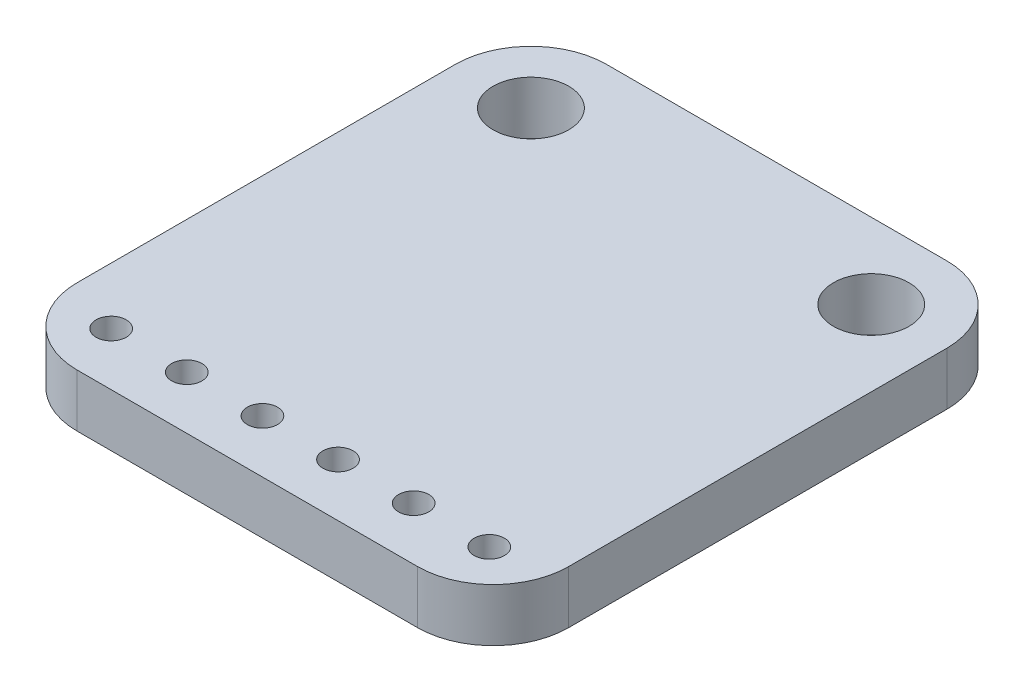
ISO-10303-21;
HEADER;
FILE_DESCRIPTION(('STEP AP214'),'2;1');
FILE_NAME('part.step','',(''),(''),'','','');
FILE_SCHEMA(('AUTOMOTIVE_DESIGN { 1 0 10303 214 1 1 1 1 }'));
ENDSEC;
DATA;
#1=APPLICATION_CONTEXT('core data for automotive mechanical design processes');
#2=APPLICATION_PROTOCOL_DEFINITION('international standard','automotive_design',2000,#1);
#3=PRODUCT_CONTEXT('',#1,'mechanical');
#4=PRODUCT('Part','Part','',(#3));
#5=PRODUCT_RELATED_PRODUCT_CATEGORY('part','',(#4));
#6=PRODUCT_DEFINITION_FORMATION('','',#4);
#7=PRODUCT_DEFINITION_CONTEXT('part definition',#1,'design');
#8=PRODUCT_DEFINITION('design','',#6,#7);
#9=PRODUCT_DEFINITION_SHAPE('','',#8);
#10=(LENGTH_UNIT() NAMED_UNIT(*) SI_UNIT(.MILLI.,.METRE.));
#11=(NAMED_UNIT(*) PLANE_ANGLE_UNIT() SI_UNIT($,.RADIAN.));
#12=(NAMED_UNIT(*) SI_UNIT($,.STERADIAN.) SOLID_ANGLE_UNIT());
#13=UNCERTAINTY_MEASURE_WITH_UNIT(LENGTH_MEASURE(1.E-05),#10,'distance_accuracy_value','');
#14=(GEOMETRIC_REPRESENTATION_CONTEXT(3) GLOBAL_UNCERTAINTY_ASSIGNED_CONTEXT((#13)) GLOBAL_UNIT_ASSIGNED_CONTEXT((#10,
#11,#12)) REPRESENTATION_CONTEXT('',''));
#15=CARTESIAN_POINT('',(0.,0.,0.));
#16=DIRECTION('',(0.,0.,1.));
#17=DIRECTION('',(1.,0.,0.));
#18=AXIS2_PLACEMENT_3D('',#15,#16,#17);
#19=CARTESIAN_POINT('',(0.,0.,0.));
#20=DIRECTION('',(0.,1.,0.));
#21=DIRECTION('',(0.,0.,1.));
#22=AXIS2_PLACEMENT_3D('',#19,#20,#21);
#23=PLANE('',#22);
#24=CARTESIAN_POINT('',(-5.715,0.,-6.34999999999999));
#25=DIRECTION('',(0.,-1.,0.));
#26=DIRECTION('',(0.,0.,-1.));
#27=AXIS2_PLACEMENT_3D('',#24,#25,#26);
#28=CIRCLE('',#27,1.27);
#29=CARTESIAN_POINT('',(-5.715,0.,-7.61999999999999));
#30=VERTEX_POINT('',#29);
#31=EDGE_CURVE('E462',#30,#30,#28,.T.);
#32=ORIENTED_EDGE('',*,*,#31,.F.);
#33=EDGE_LOOP('',(#32));
#34=FACE_BOUND('',#33,.T.);
#35=CARTESIAN_POINT('',(5.715,0.,-6.34999999999999));
#36=DIRECTION('',(0.,-1.,0.));
#37=DIRECTION('',(0.,0.,-1.));
#38=AXIS2_PLACEMENT_3D('',#35,#36,#37);
#39=CIRCLE('',#38,1.27);
#40=CARTESIAN_POINT('',(5.715,0.,-7.61999999999999));
#41=VERTEX_POINT('',#40);
#42=EDGE_CURVE('E466',#41,#41,#39,.T.);
#43=ORIENTED_EDGE('',*,*,#42,.F.);
#44=EDGE_LOOP('',(#43));
#45=FACE_BOUND('',#44,.T.);
#46=DIRECTION('',(0.,0.,1.));
#47=VECTOR('',#46,1.);
#48=CARTESIAN_POINT('',(-8.255,0.,-8.89));
#49=LINE('',#48,#47);
#50=CARTESIAN_POINT('',(-8.255,0.,-6.34999999999999));
#51=VERTEX_POINT('',#50);
#52=CARTESIAN_POINT('',(-8.255,0.,6.35));
#53=VERTEX_POINT('',#52);
#54=EDGE_CURVE('E205',#51,#53,#49,.T.);
#55=ORIENTED_EDGE('',*,*,#54,.F.);
#56=CARTESIAN_POINT('',(-5.715,0.,-6.34999999999999));
#57=DIRECTION('',(0.,1.,0.));
#58=DIRECTION('',(0.,0.,1.));
#59=AXIS2_PLACEMENT_3D('',#56,#57,#58);
#60=CIRCLE('',#59,2.54);
#61=CARTESIAN_POINT('',(-5.715,0.,-8.89));
#62=VERTEX_POINT('',#61);
#63=EDGE_CURVE('E220',#51,#62,#60,.F.);
#64=ORIENTED_EDGE('',*,*,#63,.T.);
#65=DIRECTION('',(-1.,0.,0.));
#66=VECTOR('',#65,1.);
#67=CARTESIAN_POINT('',(-8.255,0.,-8.89));
#68=LINE('',#67,#66);
#69=CARTESIAN_POINT('',(5.715,0.,-8.89));
#70=VERTEX_POINT('',#69);
#71=EDGE_CURVE('E202',#70,#62,#68,.T.);
#72=ORIENTED_EDGE('',*,*,#71,.F.);
#73=CARTESIAN_POINT('',(5.715,0.,-6.34999999999999));
#74=DIRECTION('',(0.,1.,0.));
#75=DIRECTION('',(0.,0.,1.));
#76=AXIS2_PLACEMENT_3D('',#73,#74,#75);
#77=CIRCLE('',#76,2.54);
#78=CARTESIAN_POINT('',(8.255,0.,-6.34999999999999));
#79=VERTEX_POINT('',#78);
#80=EDGE_CURVE('E218',#70,#79,#77,.F.);
#81=ORIENTED_EDGE('',*,*,#80,.T.);
#82=DIRECTION('',(0.,0.,-1.));
#83=VECTOR('',#82,1.);
#84=CARTESIAN_POINT('',(8.255,0.,-8.89));
#85=LINE('',#84,#83);
#86=CARTESIAN_POINT('',(8.255,0.,6.35));
#87=VERTEX_POINT('',#86);
#88=EDGE_CURVE('E185',#87,#79,#85,.T.);
#89=ORIENTED_EDGE('',*,*,#88,.F.);
#90=CARTESIAN_POINT('',(5.715,0.,6.35));
#91=DIRECTION('',(0.,1.,0.));
#92=DIRECTION('',(0.,0.,1.));
#93=AXIS2_PLACEMENT_3D('',#90,#91,#92);
#94=CIRCLE('',#93,2.54);
#95=CARTESIAN_POINT('',(5.715,0.,8.89));
#96=VERTEX_POINT('',#95);
#97=EDGE_CURVE('E216',#87,#96,#94,.F.);
#98=ORIENTED_EDGE('',*,*,#97,.T.);
#99=DIRECTION('',(1.,0.,0.));
#100=VECTOR('',#99,1.);
#101=CARTESIAN_POINT('',(-8.255,0.,8.89));
#102=LINE('',#101,#100);
#103=CARTESIAN_POINT('',(-5.715,0.,8.89));
#104=VERTEX_POINT('',#103);
#105=EDGE_CURVE('E190',#104,#96,#102,.T.);
#106=ORIENTED_EDGE('',*,*,#105,.F.);
#107=CARTESIAN_POINT('',(-5.715,0.,6.35));
#108=DIRECTION('',(0.,1.,0.));
#109=DIRECTION('',(0.,0.,1.));
#110=AXIS2_PLACEMENT_3D('',#107,#108,#109);
#111=CIRCLE('',#110,2.54);
#112=EDGE_CURVE('E214',#104,#53,#111,.F.);
#113=ORIENTED_EDGE('',*,*,#112,.T.);
#114=EDGE_LOOP('',(#55,#64,#72,#81,#89,#98,#106,#113));
#115=FACE_BOUND('',#114,.T.);
#116=CARTESIAN_POINT('',(-6.35,0.,7.112));
#117=DIRECTION('',(0.,1.,0.));
#118=DIRECTION('',(0.,0.,1.));
#119=AXIS2_PLACEMENT_3D('',#116,#117,#118);
#120=CIRCLE('',#119,0.508);
#121=CARTESIAN_POINT('',(-6.35,0.,7.62));
#122=VERTEX_POINT('',#121);
#123=EDGE_CURVE('E182',#122,#122,#120,.F.);
#124=ORIENTED_EDGE('',*,*,#123,.F.);
#125=EDGE_LOOP('',(#124));
#126=FACE_BOUND('',#125,.T.);
#127=CARTESIAN_POINT('',(-3.81,0.,7.112));
#128=DIRECTION('',(0.,1.,0.));
#129=DIRECTION('',(0.,0.,1.));
#130=AXIS2_PLACEMENT_3D('',#127,#128,#129);
#131=CIRCLE('',#130,0.508);
#132=CARTESIAN_POINT('',(-3.81,0.,7.62));
#133=VERTEX_POINT('',#132);
#134=EDGE_CURVE('E176',#133,#133,#131,.F.);
#135=ORIENTED_EDGE('',*,*,#134,.F.);
#136=EDGE_LOOP('',(#135));
#137=FACE_BOUND('',#136,.T.);
#138=CARTESIAN_POINT('',(-1.27,0.,7.112));
#139=DIRECTION('',(0.,1.,0.));
#140=DIRECTION('',(0.,0.,1.));
#141=AXIS2_PLACEMENT_3D('',#138,#139,#140);
#142=CIRCLE('',#141,0.508);
#143=CARTESIAN_POINT('',(-1.27,0.,7.62));
#144=VERTEX_POINT('',#143);
#145=EDGE_CURVE('E170',#144,#144,#142,.F.);
#146=ORIENTED_EDGE('',*,*,#145,.F.);
#147=EDGE_LOOP('',(#146));
#148=FACE_BOUND('',#147,.T.);
#149=CARTESIAN_POINT('',(1.27,0.,7.112));
#150=DIRECTION('',(0.,1.,0.));
#151=DIRECTION('',(0.,0.,1.));
#152=AXIS2_PLACEMENT_3D('',#149,#150,#151);
#153=CIRCLE('',#152,0.508);
#154=CARTESIAN_POINT('',(1.27,0.,7.62));
#155=VERTEX_POINT('',#154);
#156=EDGE_CURVE('E164',#155,#155,#153,.F.);
#157=ORIENTED_EDGE('',*,*,#156,.F.);
#158=EDGE_LOOP('',(#157));
#159=FACE_BOUND('',#158,.T.);
#160=CARTESIAN_POINT('',(3.81,0.,7.112));
#161=DIRECTION('',(0.,1.,0.));
#162=DIRECTION('',(0.,0.,1.));
#163=AXIS2_PLACEMENT_3D('',#160,#161,#162);
#164=CIRCLE('',#163,0.508000000000001);
#165=CARTESIAN_POINT('',(3.81,0.,7.62));
#166=VERTEX_POINT('',#165);
#167=EDGE_CURVE('E158',#166,#166,#164,.F.);
#168=ORIENTED_EDGE('',*,*,#167,.F.);
#169=EDGE_LOOP('',(#168));
#170=FACE_BOUND('',#169,.T.);
#171=CARTESIAN_POINT('',(6.35,0.,7.112));
#172=DIRECTION('',(0.,1.,0.));
#173=DIRECTION('',(0.,0.,1.));
#174=AXIS2_PLACEMENT_3D('',#171,#172,#173);
#175=CIRCLE('',#174,0.508000000000001);
#176=CARTESIAN_POINT('',(6.35,0.,7.62));
#177=VERTEX_POINT('',#176);
#178=EDGE_CURVE('E147',#177,#177,#175,.F.);
#179=ORIENTED_EDGE('',*,*,#178,.F.);
#180=EDGE_LOOP('',(#179));
#181=FACE_BOUND('',#180,.T.);
#182=DIRECTION('',(0.,0.,1.));
#183=VECTOR('',#182,1.);
#184=CARTESIAN_POINT('',(1.975,0.,-3.24499999999999));
#185=LINE('',#184,#183);
#186=CARTESIAN_POINT('',(1.975,0.,-3.24499999999999));
#187=VERTEX_POINT('',#186);
#188=CARTESIAN_POINT('',(1.975,0.,0.705000000000006));
#189=VERTEX_POINT('',#188);
#190=EDGE_CURVE('E143',#187,#189,#185,.T.);
#191=ORIENTED_EDGE('',*,*,#190,.F.);
#192=DIRECTION('',(1.,0.,0.));
#193=VECTOR('',#192,1.);
#194=CARTESIAN_POINT('',(1.975,0.,-3.24499999999999));
#195=LINE('',#194,#193);
#196=CARTESIAN_POINT('',(-1.975,0.,-3.24499999999999));
#197=VERTEX_POINT('',#196);
#198=EDGE_CURVE('E140',#197,#187,#195,.T.);
#199=ORIENTED_EDGE('',*,*,#198,.F.);
#200=DIRECTION('',(0.,0.,-1.));
#201=VECTOR('',#200,1.);
#202=CARTESIAN_POINT('',(-1.975,0.,-3.24499999999999));
#203=LINE('',#202,#201);
#204=CARTESIAN_POINT('',(-1.975,0.,0.705000000000005));
#205=VERTEX_POINT('',#204);
#206=EDGE_CURVE('E55',#205,#197,#203,.T.);
#207=ORIENTED_EDGE('',*,*,#206,.F.);
#208=DIRECTION('',(-1.,0.,0.));
#209=VECTOR('',#208,1.);
#210=CARTESIAN_POINT('',(1.975,0.,0.705000000000006));
#211=LINE('',#210,#209);
#212=EDGE_CURVE('E50',#189,#205,#211,.T.);
#213=ORIENTED_EDGE('',*,*,#212,.F.);
#214=EDGE_LOOP('',(#191,#199,#207,#213));
#215=FACE_BOUND('',#214,.T.);
#216=ADVANCED_FACE('F35',(#34,#45,#115,#126,#137,#148,#159,#170,#181,#215),#23,.F.);
#217=CARTESIAN_POINT('',(8.255,1.778,-8.89));
#218=DIRECTION('',(-1.,0.,0.));
#219=DIRECTION('',(0.,0.,1.));
#220=AXIS2_PLACEMENT_3D('',#217,#218,#219);
#221=PLANE('',#220);
#222=ORIENTED_EDGE('',*,*,#88,.T.);
#223=DIRECTION('',(0.,-1.,0.));
#224=VECTOR('',#223,1.);
#225=CARTESIAN_POINT('',(8.255,1.778,-6.34999999999999));
#226=LINE('',#225,#224);
#227=CARTESIAN_POINT('',(8.255,1.778,-6.34999999999999));
#228=VERTEX_POINT('',#227);
#229=EDGE_CURVE('E238',#79,#228,#226,.F.);
#230=ORIENTED_EDGE('',*,*,#229,.T.);
#231=DIRECTION('',(0.,0.,-1.));
#232=VECTOR('',#231,1.);
#233=CARTESIAN_POINT('',(8.255,1.778,-8.89));
#234=LINE('',#233,#232);
#235=CARTESIAN_POINT('',(8.255,1.778,6.35));
#236=VERTEX_POINT('',#235);
#237=EDGE_CURVE('E186',#236,#228,#234,.T.);
#238=ORIENTED_EDGE('',*,*,#237,.F.);
#239=DIRECTION('',(0.,-1.,0.));
#240=VECTOR('',#239,1.);
#241=CARTESIAN_POINT('',(8.255,1.778,6.35));
#242=LINE('',#241,#240);
#243=EDGE_CURVE('E235',#236,#87,#242,.T.);
#244=ORIENTED_EDGE('',*,*,#243,.T.);
#245=EDGE_LOOP('',(#222,#230,#238,#244));
#246=FACE_BOUND('',#245,.T.);
#247=ADVANCED_FACE('F258',(#246),#221,.F.);
#248=CARTESIAN_POINT('',(-8.255,1.778,-8.89));
#249=DIRECTION('',(0.,0.,1.));
#250=DIRECTION('',(1.,0.,0.));
#251=AXIS2_PLACEMENT_3D('',#248,#249,#250);
#252=PLANE('',#251);
#253=ORIENTED_EDGE('',*,*,#71,.T.);
#254=DIRECTION('',(0.,-1.,0.));
#255=VECTOR('',#254,1.);
#256=CARTESIAN_POINT('',(-5.715,1.778,-8.89));
#257=LINE('',#256,#255);
#258=CARTESIAN_POINT('',(-5.715,1.778,-8.89));
#259=VERTEX_POINT('',#258);
#260=EDGE_CURVE('E225',#62,#259,#257,.F.);
#261=ORIENTED_EDGE('',*,*,#260,.T.);
#262=DIRECTION('',(-1.,0.,0.));
#263=VECTOR('',#262,1.);
#264=CARTESIAN_POINT('',(-8.255,1.778,-8.89));
#265=LINE('',#264,#263);
#266=CARTESIAN_POINT('',(5.715,1.778,-8.89));
#267=VERTEX_POINT('',#266);
#268=EDGE_CURVE('E189',#267,#259,#265,.T.);
#269=ORIENTED_EDGE('',*,*,#268,.F.);
#270=DIRECTION('',(0.,-1.,0.));
#271=VECTOR('',#270,1.);
#272=CARTESIAN_POINT('',(5.715,1.778,-8.89));
#273=LINE('',#272,#271);
#274=EDGE_CURVE('E222',#267,#70,#273,.T.);
#275=ORIENTED_EDGE('',*,*,#274,.T.);
#276=EDGE_LOOP('',(#253,#261,#269,#275));
#277=FACE_BOUND('',#276,.T.);
#278=ADVANCED_FACE('F269',(#277),#252,.F.);
#279=CARTESIAN_POINT('',(-8.255,1.778,-8.89));
#280=DIRECTION('',(1.,0.,0.));
#281=DIRECTION('',(0.,0.,-1.));
#282=AXIS2_PLACEMENT_3D('',#279,#280,#281);
#283=PLANE('',#282);
#284=DIRECTION('',(0.,0.,1.));
#285=VECTOR('',#284,1.);
#286=CARTESIAN_POINT('',(-8.255,1.778,-8.89));
#287=LINE('',#286,#285);
#288=CARTESIAN_POINT('',(-8.255,1.778,-6.34999999999999));
#289=VERTEX_POINT('',#288);
#290=CARTESIAN_POINT('',(-8.255,1.778,6.35));
#291=VERTEX_POINT('',#290);
#292=EDGE_CURVE('E193',#289,#291,#287,.T.);
#293=ORIENTED_EDGE('',*,*,#292,.F.);
#294=DIRECTION('',(0.,-1.,0.));
#295=VECTOR('',#294,1.);
#296=CARTESIAN_POINT('',(-8.255,1.778,-6.34999999999999));
#297=LINE('',#296,#295);
#298=EDGE_CURVE('E211',#289,#51,#297,.T.);
#299=ORIENTED_EDGE('',*,*,#298,.T.);
#300=ORIENTED_EDGE('',*,*,#54,.T.);
#301=DIRECTION('',(0.,-1.,0.));
#302=VECTOR('',#301,1.);
#303=CARTESIAN_POINT('',(-8.255,1.778,6.35));
#304=LINE('',#303,#302);
#305=EDGE_CURVE('E199',#53,#291,#304,.F.);
#306=ORIENTED_EDGE('',*,*,#305,.T.);
#307=EDGE_LOOP('',(#293,#299,#300,#306));
#308=FACE_BOUND('',#307,.T.);
#309=ADVANCED_FACE('F277',(#308),#283,.F.);
#310=CARTESIAN_POINT('',(-8.255,1.778,8.89));
#311=DIRECTION('',(0.,0.,-1.));
#312=DIRECTION('',(-1.,0.,0.));
#313=AXIS2_PLACEMENT_3D('',#310,#311,#312);
#314=PLANE('',#313);
#315=ORIENTED_EDGE('',*,*,#105,.T.);
#316=DIRECTION('',(0.,-1.,0.));
#317=VECTOR('',#316,1.);
#318=CARTESIAN_POINT('',(5.715,1.778,8.89));
#319=LINE('',#318,#317);
#320=CARTESIAN_POINT('',(5.715,1.778,8.89));
#321=VERTEX_POINT('',#320);
#322=EDGE_CURVE('E11',#96,#321,#319,.F.);
#323=ORIENTED_EDGE('',*,*,#322,.T.);
#324=DIRECTION('',(1.,0.,0.));
#325=VECTOR('',#324,1.);
#326=CARTESIAN_POINT('',(-8.255,1.778,8.89));
#327=LINE('',#326,#325);
#328=CARTESIAN_POINT('',(-5.715,1.778,8.89));
#329=VERTEX_POINT('',#328);
#330=EDGE_CURVE('E196',#329,#321,#327,.T.);
#331=ORIENTED_EDGE('',*,*,#330,.F.);
#332=DIRECTION('',(0.,-1.,0.));
#333=VECTOR('',#332,1.);
#334=CARTESIAN_POINT('',(-5.715,1.778,8.89));
#335=LINE('',#334,#333);
#336=EDGE_CURVE('E43',#329,#104,#335,.T.);
#337=ORIENTED_EDGE('',*,*,#336,.T.);
#338=EDGE_LOOP('',(#315,#323,#331,#337));
#339=FACE_BOUND('',#338,.T.);
#340=ADVANCED_FACE('F244',(#339),#314,.F.);
#341=CARTESIAN_POINT('',(0.,1.778,0.));
#342=DIRECTION('',(0.,1.,0.));
#343=DIRECTION('',(0.,0.,1.));
#344=AXIS2_PLACEMENT_3D('',#341,#342,#343);
#345=PLANE('',#344);
#346=CARTESIAN_POINT('',(-5.715,1.778,-6.34999999999999));
#347=DIRECTION('',(0.,1.,0.));
#348=DIRECTION('',(0.,0.,1.));
#349=AXIS2_PLACEMENT_3D('',#346,#347,#348);
#350=CIRCLE('',#349,1.27);
#351=CARTESIAN_POINT('',(-5.715,1.778,-5.07999999999999));
#352=VERTEX_POINT('',#351);
#353=EDGE_CURVE('E460',#352,#352,#350,.F.);
#354=ORIENTED_EDGE('',*,*,#353,.T.);
#355=EDGE_LOOP('',(#354));
#356=FACE_BOUND('',#355,.T.);
#357=CARTESIAN_POINT('',(5.715,1.778,-6.34999999999999));
#358=DIRECTION('',(0.,1.,0.));
#359=DIRECTION('',(0.,0.,1.));
#360=AXIS2_PLACEMENT_3D('',#357,#358,#359);
#361=CIRCLE('',#360,1.27);
#362=CARTESIAN_POINT('',(5.715,1.778,-5.07999999999999));
#363=VERTEX_POINT('',#362);
#364=EDGE_CURVE('E463',#363,#363,#361,.F.);
#365=ORIENTED_EDGE('',*,*,#364,.T.);
#366=EDGE_LOOP('',(#365));
#367=FACE_BOUND('',#366,.T.);
#368=CARTESIAN_POINT('',(6.35,1.778,7.112));
#369=DIRECTION('',(0.,1.,0.));
#370=DIRECTION('',(0.,0.,1.));
#371=AXIS2_PLACEMENT_3D('',#368,#369,#370);
#372=CIRCLE('',#371,0.508000000000001);
#373=CARTESIAN_POINT('',(6.35,1.778,7.62));
#374=VERTEX_POINT('',#373);
#375=EDGE_CURVE('E144',#374,#374,#372,.T.);
#376=ORIENTED_EDGE('',*,*,#375,.F.);
#377=EDGE_LOOP('',(#376));
#378=FACE_BOUND('',#377,.T.);
#379=CARTESIAN_POINT('',(3.81,1.778,7.112));
#380=DIRECTION('',(0.,1.,0.));
#381=DIRECTION('',(0.,0.,1.));
#382=AXIS2_PLACEMENT_3D('',#379,#380,#381);
#383=CIRCLE('',#382,0.508000000000001);
#384=CARTESIAN_POINT('',(3.81,1.778,7.62));
#385=VERTEX_POINT('',#384);
#386=EDGE_CURVE('E155',#385,#385,#383,.T.);
#387=ORIENTED_EDGE('',*,*,#386,.F.);
#388=EDGE_LOOP('',(#387));
#389=FACE_BOUND('',#388,.T.);
#390=CARTESIAN_POINT('',(1.27,1.778,7.112));
#391=DIRECTION('',(0.,1.,0.));
#392=DIRECTION('',(0.,0.,1.));
#393=AXIS2_PLACEMENT_3D('',#390,#391,#392);
#394=CIRCLE('',#393,0.508);
#395=CARTESIAN_POINT('',(1.27,1.778,7.62));
#396=VERTEX_POINT('',#395);
#397=EDGE_CURVE('E161',#396,#396,#394,.T.);
#398=ORIENTED_EDGE('',*,*,#397,.F.);
#399=EDGE_LOOP('',(#398));
#400=FACE_BOUND('',#399,.T.);
#401=CARTESIAN_POINT('',(-1.27,1.778,7.112));
#402=DIRECTION('',(0.,1.,0.));
#403=DIRECTION('',(0.,0.,1.));
#404=AXIS2_PLACEMENT_3D('',#401,#402,#403);
#405=CIRCLE('',#404,0.508);
#406=CARTESIAN_POINT('',(-1.27,1.778,7.62));
#407=VERTEX_POINT('',#406);
#408=EDGE_CURVE('E167',#407,#407,#405,.T.);
#409=ORIENTED_EDGE('',*,*,#408,.F.);
#410=EDGE_LOOP('',(#409));
#411=FACE_BOUND('',#410,.T.);
#412=CARTESIAN_POINT('',(-3.81,1.778,7.112));
#413=DIRECTION('',(0.,1.,0.));
#414=DIRECTION('',(0.,0.,1.));
#415=AXIS2_PLACEMENT_3D('',#412,#413,#414);
#416=CIRCLE('',#415,0.508);
#417=CARTESIAN_POINT('',(-3.81,1.778,7.62));
#418=VERTEX_POINT('',#417);
#419=EDGE_CURVE('E173',#418,#418,#416,.T.);
#420=ORIENTED_EDGE('',*,*,#419,.F.);
#421=EDGE_LOOP('',(#420));
#422=FACE_BOUND('',#421,.T.);
#423=CARTESIAN_POINT('',(-6.35,1.778,7.112));
#424=DIRECTION('',(0.,1.,0.));
#425=DIRECTION('',(0.,0.,1.));
#426=AXIS2_PLACEMENT_3D('',#423,#424,#425);
#427=CIRCLE('',#426,0.508);
#428=CARTESIAN_POINT('',(-6.35,1.778,7.62));
#429=VERTEX_POINT('',#428);
#430=EDGE_CURVE('E179',#429,#429,#427,.T.);
#431=ORIENTED_EDGE('',*,*,#430,.F.);
#432=EDGE_LOOP('',(#431));
#433=FACE_BOUND('',#432,.T.);
#434=ORIENTED_EDGE('',*,*,#268,.T.);
#435=CARTESIAN_POINT('',(-5.715,1.778,-6.34999999999999));
#436=DIRECTION('',(0.,1.,0.));
#437=DIRECTION('',(0.,0.,1.));
#438=AXIS2_PLACEMENT_3D('',#435,#436,#437);
#439=CIRCLE('',#438,2.54);
#440=EDGE_CURVE('E233',#259,#289,#439,.T.);
#441=ORIENTED_EDGE('',*,*,#440,.T.);
#442=ORIENTED_EDGE('',*,*,#292,.T.);
#443=CARTESIAN_POINT('',(-5.715,1.778,6.35));
#444=DIRECTION('',(0.,1.,0.));
#445=DIRECTION('',(0.,0.,1.));
#446=AXIS2_PLACEMENT_3D('',#443,#444,#445);
#447=CIRCLE('',#446,2.54);
#448=EDGE_CURVE('E227',#291,#329,#447,.T.);
#449=ORIENTED_EDGE('',*,*,#448,.T.);
#450=ORIENTED_EDGE('',*,*,#330,.T.);
#451=CARTESIAN_POINT('',(5.715,1.778,6.35));
#452=DIRECTION('',(0.,1.,0.));
#453=DIRECTION('',(0.,0.,1.));
#454=AXIS2_PLACEMENT_3D('',#451,#452,#453);
#455=CIRCLE('',#454,2.54);
#456=EDGE_CURVE('E229',#321,#236,#455,.T.);
#457=ORIENTED_EDGE('',*,*,#456,.T.);
#458=ORIENTED_EDGE('',*,*,#237,.T.);
#459=CARTESIAN_POINT('',(5.715,1.778,-6.34999999999999));
#460=DIRECTION('',(0.,1.,0.));
#461=DIRECTION('',(0.,0.,1.));
#462=AXIS2_PLACEMENT_3D('',#459,#460,#461);
#463=CIRCLE('',#462,2.54);
#464=EDGE_CURVE('E231',#228,#267,#463,.T.);
#465=ORIENTED_EDGE('',*,*,#464,.T.);
#466=EDGE_LOOP('',(#434,#441,#442,#449,#450,#457,#458,#465));
#467=FACE_BOUND('',#466,.T.);
#468=ADVANCED_FACE('F262',(#356,#367,#378,#389,#400,#411,#422,#433,#467),#345,.T.);
#469=CARTESIAN_POINT('',(-5.715,1.778,-6.34999999999999));
#470=DIRECTION('',(0.,-1.,0.));
#471=DIRECTION('',(0.,0.,-1.));
#472=AXIS2_PLACEMENT_3D('',#469,#470,#471);
#473=CYLINDRICAL_SURFACE('',#472,2.54);
#474=ORIENTED_EDGE('',*,*,#440,.F.);
#475=ORIENTED_EDGE('',*,*,#260,.F.);
#476=ORIENTED_EDGE('',*,*,#63,.F.);
#477=ORIENTED_EDGE('',*,*,#298,.F.);
#478=EDGE_LOOP('',(#474,#475,#476,#477));
#479=FACE_BOUND('',#478,.T.);
#480=ADVANCED_FACE('F274',(#479),#473,.T.);
#481=CARTESIAN_POINT('',(5.715,1.778,-6.34999999999999));
#482=DIRECTION('',(0.,-1.,0.));
#483=DIRECTION('',(0.,0.,-1.));
#484=AXIS2_PLACEMENT_3D('',#481,#482,#483);
#485=CYLINDRICAL_SURFACE('',#484,2.54);
#486=ORIENTED_EDGE('',*,*,#464,.F.);
#487=ORIENTED_EDGE('',*,*,#229,.F.);
#488=ORIENTED_EDGE('',*,*,#80,.F.);
#489=ORIENTED_EDGE('',*,*,#274,.F.);
#490=EDGE_LOOP('',(#486,#487,#488,#489));
#491=FACE_BOUND('',#490,.T.);
#492=ADVANCED_FACE('F266',(#491),#485,.T.);
#493=CARTESIAN_POINT('',(5.715,1.778,6.35));
#494=DIRECTION('',(0.,-1.,0.));
#495=DIRECTION('',(0.,0.,-1.));
#496=AXIS2_PLACEMENT_3D('',#493,#494,#495);
#497=CYLINDRICAL_SURFACE('',#496,2.54);
#498=ORIENTED_EDGE('',*,*,#456,.F.);
#499=ORIENTED_EDGE('',*,*,#322,.F.);
#500=ORIENTED_EDGE('',*,*,#97,.F.);
#501=ORIENTED_EDGE('',*,*,#243,.F.);
#502=EDGE_LOOP('',(#498,#499,#500,#501));
#503=FACE_BOUND('',#502,.T.);
#504=ADVANCED_FACE('F255',(#503),#497,.T.);
#505=CARTESIAN_POINT('',(-5.715,1.778,6.35));
#506=DIRECTION('',(0.,-1.,0.));
#507=DIRECTION('',(0.,0.,-1.));
#508=AXIS2_PLACEMENT_3D('',#505,#506,#507);
#509=CYLINDRICAL_SURFACE('',#508,2.54);
#510=ORIENTED_EDGE('',*,*,#448,.F.);
#511=ORIENTED_EDGE('',*,*,#305,.F.);
#512=ORIENTED_EDGE('',*,*,#112,.F.);
#513=ORIENTED_EDGE('',*,*,#336,.F.);
#514=EDGE_LOOP('',(#510,#511,#512,#513));
#515=FACE_BOUND('',#514,.T.);
#516=ADVANCED_FACE('F37',(#515),#509,.T.);
#517=CARTESIAN_POINT('',(-6.35,-0.000999999999999916,7.112));
#518=DIRECTION('',(0.,1.,0.));
#519=DIRECTION('',(0.,0.,1.));
#520=AXIS2_PLACEMENT_3D('',#517,#518,#519);
#521=CYLINDRICAL_SURFACE('',#520,0.508);
#522=ORIENTED_EDGE('',*,*,#430,.T.);
#523=EDGE_LOOP('',(#522));
#524=FACE_BOUND('',#523,.T.);
#525=ORIENTED_EDGE('',*,*,#123,.T.);
#526=EDGE_LOOP('',(#525));
#527=FACE_BOUND('',#526,.T.);
#528=ADVANCED_FACE('F280',(#524,#527),#521,.F.);
#529=CARTESIAN_POINT('',(-3.81,-0.000999999999999916,7.112));
#530=DIRECTION('',(0.,1.,0.));
#531=DIRECTION('',(0.,0.,1.));
#532=AXIS2_PLACEMENT_3D('',#529,#530,#531);
#533=CYLINDRICAL_SURFACE('',#532,0.508);
#534=ORIENTED_EDGE('',*,*,#419,.T.);
#535=EDGE_LOOP('',(#534));
#536=FACE_BOUND('',#535,.T.);
#537=ORIENTED_EDGE('',*,*,#134,.T.);
#538=EDGE_LOOP('',(#537));
#539=FACE_BOUND('',#538,.T.);
#540=ADVANCED_FACE('F285',(#536,#539),#533,.F.);
#541=CARTESIAN_POINT('',(-1.27,-0.000999999999999916,7.112));
#542=DIRECTION('',(0.,1.,0.));
#543=DIRECTION('',(0.,0.,1.));
#544=AXIS2_PLACEMENT_3D('',#541,#542,#543);
#545=CYLINDRICAL_SURFACE('',#544,0.508);
#546=ORIENTED_EDGE('',*,*,#408,.T.);
#547=EDGE_LOOP('',(#546));
#548=FACE_BOUND('',#547,.T.);
#549=ORIENTED_EDGE('',*,*,#145,.T.);
#550=EDGE_LOOP('',(#549));
#551=FACE_BOUND('',#550,.T.);
#552=ADVANCED_FACE('F336',(#548,#551),#545,.F.);
#553=CARTESIAN_POINT('',(1.27,-0.000999999999999916,7.112));
#554=DIRECTION('',(0.,1.,0.));
#555=DIRECTION('',(0.,0.,1.));
#556=AXIS2_PLACEMENT_3D('',#553,#554,#555);
#557=CYLINDRICAL_SURFACE('',#556,0.508);
#558=ORIENTED_EDGE('',*,*,#397,.T.);
#559=EDGE_LOOP('',(#558));
#560=FACE_BOUND('',#559,.T.);
#561=ORIENTED_EDGE('',*,*,#156,.T.);
#562=EDGE_LOOP('',(#561));
#563=FACE_BOUND('',#562,.T.);
#564=ADVANCED_FACE('F346',(#560,#563),#557,.F.);
#565=CARTESIAN_POINT('',(3.81,-0.000999999999999916,7.112));
#566=DIRECTION('',(0.,1.,0.));
#567=DIRECTION('',(0.,0.,1.));
#568=AXIS2_PLACEMENT_3D('',#565,#566,#567);
#569=CYLINDRICAL_SURFACE('',#568,0.508000000000001);
#570=ORIENTED_EDGE('',*,*,#386,.T.);
#571=EDGE_LOOP('',(#570));
#572=FACE_BOUND('',#571,.T.);
#573=ORIENTED_EDGE('',*,*,#167,.T.);
#574=EDGE_LOOP('',(#573));
#575=FACE_BOUND('',#574,.T.);
#576=ADVANCED_FACE('F356',(#572,#575),#569,.F.);
#577=CARTESIAN_POINT('',(6.35,-0.000999999999999916,7.112));
#578=DIRECTION('',(0.,1.,0.));
#579=DIRECTION('',(0.,0.,1.));
#580=AXIS2_PLACEMENT_3D('',#577,#578,#579);
#581=CYLINDRICAL_SURFACE('',#580,0.508000000000001);
#582=ORIENTED_EDGE('',*,*,#375,.T.);
#583=EDGE_LOOP('',(#582));
#584=FACE_BOUND('',#583,.T.);
#585=ORIENTED_EDGE('',*,*,#178,.T.);
#586=EDGE_LOOP('',(#585));
#587=FACE_BOUND('',#586,.T.);
#588=ADVANCED_FACE('F366',(#584,#587),#581,.F.);
#589=CARTESIAN_POINT('',(1.975,-1.397,-3.24499999999999));
#590=DIRECTION('',(-1.,0.,0.));
#591=DIRECTION('',(0.,0.,1.));
#592=AXIS2_PLACEMENT_3D('',#589,#590,#591);
#593=PLANE('',#592);
#594=ORIENTED_EDGE('',*,*,#190,.T.);
#595=DIRECTION('',(0.,1.,0.));
#596=VECTOR('',#595,1.);
#597=CARTESIAN_POINT('',(1.975,-1.397,0.705000000000006));
#598=LINE('',#597,#596);
#599=CARTESIAN_POINT('',(1.975,-1.397,0.705000000000006));
#600=VERTEX_POINT('',#599);
#601=EDGE_CURVE('E124',#600,#189,#598,.T.);
#602=ORIENTED_EDGE('',*,*,#601,.F.);
#603=DIRECTION('',(0.,0.,1.));
#604=VECTOR('',#603,1.);
#605=CARTESIAN_POINT('',(1.975,-1.397,-3.24499999999999));
#606=LINE('',#605,#604);
#607=CARTESIAN_POINT('',(1.975,-1.397,-3.24499999999999));
#608=VERTEX_POINT('',#607);
#609=EDGE_CURVE('E131',#608,#600,#606,.T.);
#610=ORIENTED_EDGE('',*,*,#609,.F.);
#611=DIRECTION('',(0.,1.,0.));
#612=VECTOR('',#611,1.);
#613=CARTESIAN_POINT('',(1.975,-1.397,-3.24499999999999));
#614=LINE('',#613,#612);
#615=EDGE_CURVE('E474',#608,#187,#614,.T.);
#616=ORIENTED_EDGE('',*,*,#615,.T.);
#617=EDGE_LOOP('',(#594,#602,#610,#616));
#618=FACE_BOUND('',#617,.T.);
#619=ADVANCED_FACE('F142',(#618),#593,.F.);
#620=CARTESIAN_POINT('',(1.975,-1.397,0.705000000000006));
#621=DIRECTION('',(0.,0.,-1.));
#622=DIRECTION('',(-1.,0.,0.));
#623=AXIS2_PLACEMENT_3D('',#620,#621,#622);
#624=PLANE('',#623);
#625=ORIENTED_EDGE('',*,*,#212,.T.);
#626=DIRECTION('',(0.,1.,0.));
#627=VECTOR('',#626,1.);
#628=CARTESIAN_POINT('',(-1.975,-1.397,0.705000000000005));
#629=LINE('',#628,#627);
#630=CARTESIAN_POINT('',(-1.975,-1.397,0.705000000000005));
#631=VERTEX_POINT('',#630);
#632=EDGE_CURVE('E127',#631,#205,#629,.T.);
#633=ORIENTED_EDGE('',*,*,#632,.F.);
#634=DIRECTION('',(-1.,0.,0.));
#635=VECTOR('',#634,1.);
#636=CARTESIAN_POINT('',(1.975,-1.397,0.705000000000006));
#637=LINE('',#636,#635);
#638=EDGE_CURVE('E120',#600,#631,#637,.T.);
#639=ORIENTED_EDGE('',*,*,#638,.F.);
#640=ORIENTED_EDGE('',*,*,#601,.T.);
#641=EDGE_LOOP('',(#625,#633,#639,#640));
#642=FACE_BOUND('',#641,.T.);
#643=ADVANCED_FACE('F122',(#642),#624,.F.);
#644=CARTESIAN_POINT('',(-1.975,-1.397,-3.24499999999999));
#645=DIRECTION('',(1.,0.,0.));
#646=DIRECTION('',(0.,0.,-1.));
#647=AXIS2_PLACEMENT_3D('',#644,#645,#646);
#648=PLANE('',#647);
#649=ORIENTED_EDGE('',*,*,#206,.T.);
#650=DIRECTION('',(0.,1.,0.));
#651=VECTOR('',#650,1.);
#652=CARTESIAN_POINT('',(-1.975,-1.397,-3.24499999999999));
#653=LINE('',#652,#651);
#654=CARTESIAN_POINT('',(-1.975,-1.397,-3.24499999999999));
#655=VERTEX_POINT('',#654);
#656=EDGE_CURVE('E149',#655,#197,#653,.T.);
#657=ORIENTED_EDGE('',*,*,#656,.F.);
#658=DIRECTION('',(0.,0.,-1.));
#659=VECTOR('',#658,1.);
#660=CARTESIAN_POINT('',(-1.975,-1.397,-3.24499999999999));
#661=LINE('',#660,#659);
#662=EDGE_CURVE('E130',#631,#655,#661,.T.);
#663=ORIENTED_EDGE('',*,*,#662,.F.);
#664=ORIENTED_EDGE('',*,*,#632,.T.);
#665=EDGE_LOOP('',(#649,#657,#663,#664));
#666=FACE_BOUND('',#665,.T.);
#667=ADVANCED_FACE('F394',(#666),#648,.F.);
#668=CARTESIAN_POINT('',(1.975,-1.397,-3.24499999999999));
#669=DIRECTION('',(0.,0.,1.));
#670=DIRECTION('',(1.,0.,0.));
#671=AXIS2_PLACEMENT_3D('',#668,#669,#670);
#672=PLANE('',#671);
#673=ORIENTED_EDGE('',*,*,#198,.T.);
#674=ORIENTED_EDGE('',*,*,#615,.F.);
#675=DIRECTION('',(1.,0.,0.));
#676=VECTOR('',#675,1.);
#677=CARTESIAN_POINT('',(1.975,-1.397,-3.24499999999999));
#678=LINE('',#677,#676);
#679=EDGE_CURVE('E136',#655,#608,#678,.T.);
#680=ORIENTED_EDGE('',*,*,#679,.F.);
#681=ORIENTED_EDGE('',*,*,#656,.T.);
#682=EDGE_LOOP('',(#673,#674,#680,#681));
#683=FACE_BOUND('',#682,.T.);
#684=ADVANCED_FACE('F403',(#683),#672,.F.);
#685=CARTESIAN_POINT('',(0.,-1.397,0.));
#686=DIRECTION('',(0.,-1.,0.));
#687=DIRECTION('',(0.,0.,-1.));
#688=AXIS2_PLACEMENT_3D('',#685,#686,#687);
#689=PLANE('',#688);
#690=ORIENTED_EDGE('',*,*,#609,.T.);
#691=ORIENTED_EDGE('',*,*,#638,.T.);
#692=ORIENTED_EDGE('',*,*,#662,.T.);
#693=ORIENTED_EDGE('',*,*,#679,.T.);
#694=EDGE_LOOP('',(#690,#691,#692,#693));
#695=FACE_BOUND('',#694,.T.);
#696=ADVANCED_FACE('F134',(#695),#689,.T.);
#697=CARTESIAN_POINT('',(5.715,1.779,-6.34999999999999));
#698=DIRECTION('',(0.,-1.,0.));
#699=DIRECTION('',(0.,0.,-1.));
#700=AXIS2_PLACEMENT_3D('',#697,#698,#699);
#701=CYLINDRICAL_SURFACE('',#700,1.27);
#702=ORIENTED_EDGE('',*,*,#364,.F.);
#703=EDGE_LOOP('',(#702));
#704=FACE_BOUND('',#703,.T.);
#705=ORIENTED_EDGE('',*,*,#42,.T.);
#706=EDGE_LOOP('',(#705));
#707=FACE_BOUND('',#706,.T.);
#708=ADVANCED_FACE('F421',(#704,#707),#701,.F.);
#709=CARTESIAN_POINT('',(-5.715,1.779,-6.34999999999999));
#710=DIRECTION('',(0.,-1.,0.));
#711=DIRECTION('',(0.,0.,-1.));
#712=AXIS2_PLACEMENT_3D('',#709,#710,#711);
#713=CYLINDRICAL_SURFACE('',#712,1.27);
#714=ORIENTED_EDGE('',*,*,#353,.F.);
#715=EDGE_LOOP('',(#714));
#716=FACE_BOUND('',#715,.T.);
#717=ORIENTED_EDGE('',*,*,#31,.T.);
#718=EDGE_LOOP('',(#717));
#719=FACE_BOUND('',#718,.T.);
#720=ADVANCED_FACE('F443',(#716,#719),#713,.F.);
#721=CLOSED_SHELL('',(#216,#247,#278,#309,#340,#468,#480,#492,#504,#516,#528,#540,#552,#564,
#576,#588,#619,#643,#667,#684,#696,#708,#720));
#722=MANIFOLD_SOLID_BREP('B2',#721);
#723=ADVANCED_BREP_SHAPE_REPRESENTATION('',(#18,#722),#14);
#724=SHAPE_DEFINITION_REPRESENTATION(#9,#723);
ENDSEC;
END-ISO-10303-21;
